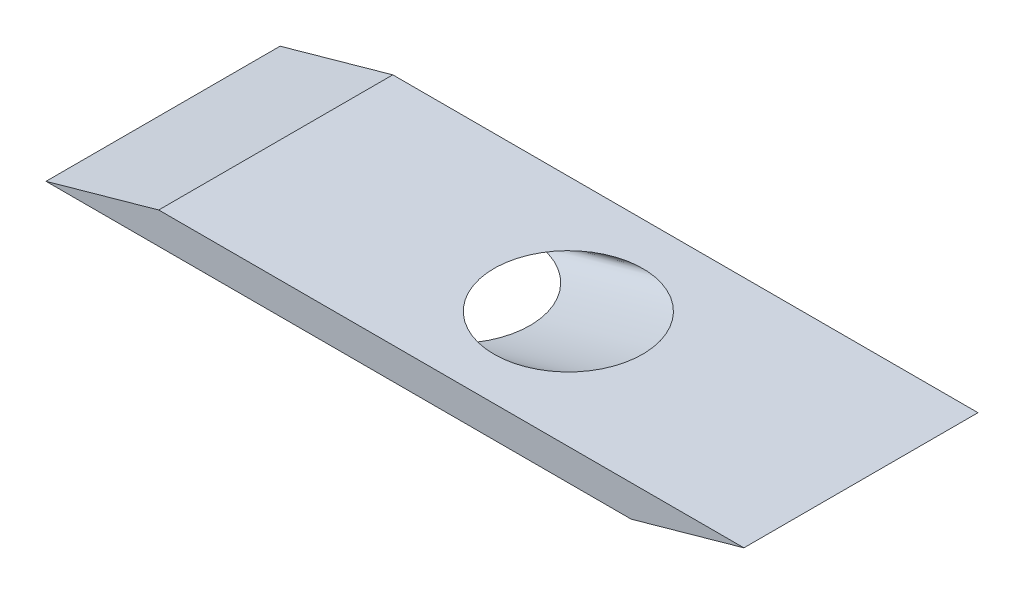
ISO-10303-21;
HEADER;
FILE_DESCRIPTION(('STEP AP214'),'2;1');
FILE_NAME('part.step','',(''),(''),'','','');
FILE_SCHEMA(('AUTOMOTIVE_DESIGN { 1 0 10303 214 1 1 1 1 }'));
ENDSEC;
DATA;
#1=APPLICATION_CONTEXT('core data for automotive mechanical design processes');
#2=APPLICATION_PROTOCOL_DEFINITION('international standard','automotive_design',2000,#1);
#3=PRODUCT_CONTEXT('',#1,'mechanical');
#4=PRODUCT('Part','Part','',(#3));
#5=PRODUCT_RELATED_PRODUCT_CATEGORY('part','',(#4));
#6=PRODUCT_DEFINITION_FORMATION('','',#4);
#7=PRODUCT_DEFINITION_CONTEXT('part definition',#1,'design');
#8=PRODUCT_DEFINITION('design','',#6,#7);
#9=PRODUCT_DEFINITION_SHAPE('','',#8);
#10=(LENGTH_UNIT() NAMED_UNIT(*) SI_UNIT(.MILLI.,.METRE.));
#11=(NAMED_UNIT(*) PLANE_ANGLE_UNIT() SI_UNIT($,.RADIAN.));
#12=(NAMED_UNIT(*) SI_UNIT($,.STERADIAN.) SOLID_ANGLE_UNIT());
#13=UNCERTAINTY_MEASURE_WITH_UNIT(LENGTH_MEASURE(1.E-05),#10,'distance_accuracy_value','');
#14=(GEOMETRIC_REPRESENTATION_CONTEXT(3) GLOBAL_UNCERTAINTY_ASSIGNED_CONTEXT((#13)) GLOBAL_UNIT_ASSIGNED_CONTEXT((#10,
#11,#12)) REPRESENTATION_CONTEXT('',''));
#15=CARTESIAN_POINT('',(0.,0.,0.));
#16=DIRECTION('',(0.,0.,1.));
#17=DIRECTION('',(1.,0.,0.));
#18=AXIS2_PLACEMENT_3D('',#15,#16,#17);
#19=CARTESIAN_POINT('',(19.2605153012445,5.38818618187283,0.));
#20=DIRECTION('',(0.,1.,0.));
#21=DIRECTION('',(0.,0.,1.));
#22=AXIS2_PLACEMENT_3D('',#19,#20,#21);
#23=PLANE('',#22);
#24=DIRECTION('',(0.,0.,-1.));
#25=VECTOR('',#24,1.);
#26=CARTESIAN_POINT('',(69.2605153012445,5.38818618187283,-20.));
#27=LINE('',#26,#25);
#28=CARTESIAN_POINT('',(69.2605153012445,5.38818618187283,20.));
#29=VERTEX_POINT('',#28);
#30=CARTESIAN_POINT('',(69.2605153012445,5.38818618187283,-20.));
#31=VERTEX_POINT('',#30);
#32=EDGE_CURVE('E85',#29,#31,#27,.T.);
#33=ORIENTED_EDGE('',*,*,#32,.T.);
#34=DIRECTION('',(-1.,0.,0.));
#35=VECTOR('',#34,1.);
#36=CARTESIAN_POINT('',(-30.7394846987555,5.38818618187283,-20.));
#37=LINE('',#36,#35);
#38=CARTESIAN_POINT('',(-30.7394846987555,5.38818618187283,-20.));
#39=VERTEX_POINT('',#38);
#40=EDGE_CURVE('E80',#31,#39,#37,.T.);
#41=ORIENTED_EDGE('',*,*,#40,.T.);
#42=DIRECTION('',(0.,0.,1.));
#43=VECTOR('',#42,1.);
#44=CARTESIAN_POINT('',(-30.7394846987555,5.38818618187283,-20.));
#45=LINE('',#44,#43);
#46=CARTESIAN_POINT('',(-30.7394846987555,5.38818618187283,20.));
#47=VERTEX_POINT('',#46);
#48=EDGE_CURVE('E83',#39,#47,#45,.T.);
#49=ORIENTED_EDGE('',*,*,#48,.T.);
#50=DIRECTION('',(1.,0.,0.));
#51=VECTOR('',#50,1.);
#52=CARTESIAN_POINT('',(-30.7394846987555,5.38818618187283,20.));
#53=LINE('',#52,#51);
#54=EDGE_CURVE('E50',#47,#29,#53,.T.);
#55=ORIENTED_EDGE('',*,*,#54,.T.);
#56=EDGE_LOOP('',(#33,#41,#49,#55));
#57=FACE_BOUND('',#56,.T.);
#58=CARTESIAN_POINT('',(19.2605153012446,5.38818618187283,0.));
#59=DIRECTION('',(0.,1.,0.));
#60=DIRECTION('',(0.,0.,1.));
#61=AXIS2_PLACEMENT_3D('',#58,#59,#60);
#62=CIRCLE('',#61,12.7);
#63=CARTESIAN_POINT('',(19.2605153012446,5.38818618187283,12.7));
#64=VERTEX_POINT('',#63);
#65=EDGE_CURVE('E100',#64,#64,#62,.T.);
#66=ORIENTED_EDGE('',*,*,#65,.F.);
#67=EDGE_LOOP('',(#66));
#68=FACE_BOUND('',#67,.T.);
#69=ADVANCED_FACE('F33',(#57,#68),#23,.T.);
#70=CARTESIAN_POINT('',(0.,0.,0.));
#71=DIRECTION('',(0.,1.,0.));
#72=DIRECTION('',(0.,0.,1.));
#73=AXIS2_PLACEMENT_3D('',#70,#71,#72);
#74=PLANE('',#73);
#75=DIRECTION('',(0.,0.,-1.));
#76=VECTOR('',#75,1.);
#77=CARTESIAN_POINT('',(50.,0.,-20.));
#78=LINE('',#77,#76);
#79=CARTESIAN_POINT('',(50.,0.,20.));
#80=VERTEX_POINT('',#79);
#81=CARTESIAN_POINT('',(50.,0.,-20.));
#82=VERTEX_POINT('',#81);
#83=EDGE_CURVE('E97',#80,#82,#78,.T.);
#84=ORIENTED_EDGE('',*,*,#83,.F.);
#85=DIRECTION('',(1.,0.,0.));
#86=VECTOR('',#85,1.);
#87=CARTESIAN_POINT('',(-50.,0.,20.));
#88=LINE('',#87,#86);
#89=CARTESIAN_POINT('',(-50.,0.,20.));
#90=VERTEX_POINT('',#89);
#91=EDGE_CURVE('E73',#90,#80,#88,.T.);
#92=ORIENTED_EDGE('',*,*,#91,.F.);
#93=DIRECTION('',(0.,0.,1.));
#94=VECTOR('',#93,1.);
#95=CARTESIAN_POINT('',(-50.,0.,-20.));
#96=LINE('',#95,#94);
#97=CARTESIAN_POINT('',(-50.,0.,-20.));
#98=VERTEX_POINT('',#97);
#99=EDGE_CURVE('E67',#98,#90,#96,.T.);
#100=ORIENTED_EDGE('',*,*,#99,.F.);
#101=DIRECTION('',(-1.,0.,0.));
#102=VECTOR('',#101,1.);
#103=CARTESIAN_POINT('',(-50.,0.,-20.));
#104=LINE('',#103,#102);
#105=EDGE_CURVE('E89',#82,#98,#104,.T.);
#106=ORIENTED_EDGE('',*,*,#105,.F.);
#107=EDGE_LOOP('',(#84,#92,#100,#106));
#108=FACE_BOUND('',#107,.T.);
#109=CARTESIAN_POINT('',(0.,0.,0.));
#110=DIRECTION('',(0.,1.,0.));
#111=DIRECTION('',(0.,0.,1.));
#112=AXIS2_PLACEMENT_3D('',#109,#110,#111);
#113=CIRCLE('',#112,12.7);
#114=CARTESIAN_POINT('',(0.,0.,12.7));
#115=VERTEX_POINT('',#114);
#116=EDGE_CURVE('E112',#115,#115,#113,.T.);
#117=ORIENTED_EDGE('',*,*,#116,.T.);
#118=EDGE_LOOP('',(#117));
#119=FACE_BOUND('',#118,.T.);
#120=ADVANCED_FACE('F108',(#108,#119),#74,.F.);
#121=CARTESIAN_POINT('',(69.2605153012445,5.38818618187283,-20.));
#122=DIRECTION('',(-0.269409309093642,0.963025765062227,0.));
#123=DIRECTION('',(-0.963025765062227,-0.269409309093642,0.));
#124=AXIS2_PLACEMENT_3D('',#121,#122,#123);
#125=PLANE('',#124);
#126=ORIENTED_EDGE('',*,*,#83,.T.);
#127=DIRECTION('',(-0.963025765062227,-0.269409309093642,0.));
#128=VECTOR('',#127,1.);
#129=CARTESIAN_POINT('',(69.2605153012445,5.38818618187283,-20.));
#130=LINE('',#129,#128);
#131=EDGE_CURVE('E11',#31,#82,#130,.T.);
#132=ORIENTED_EDGE('',*,*,#131,.F.);
#133=ORIENTED_EDGE('',*,*,#32,.F.);
#134=DIRECTION('',(-0.963025765062227,-0.269409309093642,0.));
#135=VECTOR('',#134,1.);
#136=CARTESIAN_POINT('',(69.2605153012445,5.38818618187283,20.));
#137=LINE('',#136,#135);
#138=EDGE_CURVE('E93',#29,#80,#137,.T.);
#139=ORIENTED_EDGE('',*,*,#138,.T.);
#140=EDGE_LOOP('',(#126,#132,#133,#139));
#141=FACE_BOUND('',#140,.T.);
#142=ADVANCED_FACE('F35',(#141),#125,.F.);
#143=CARTESIAN_POINT('',(-30.7394846987555,5.38818618187283,-20.));
#144=DIRECTION('',(0.,0.,1.));
#145=DIRECTION('',(1.,0.,0.));
#146=AXIS2_PLACEMENT_3D('',#143,#144,#145);
#147=PLANE('',#146);
#148=ORIENTED_EDGE('',*,*,#105,.T.);
#149=DIRECTION('',(-0.963025765062227,-0.269409309093642,0.));
#150=VECTOR('',#149,1.);
#151=CARTESIAN_POINT('',(-30.7394846987555,5.38818618187283,-20.));
#152=LINE('',#151,#150);
#153=EDGE_CURVE('E42',#39,#98,#152,.T.);
#154=ORIENTED_EDGE('',*,*,#153,.F.);
#155=ORIENTED_EDGE('',*,*,#40,.F.);
#156=ORIENTED_EDGE('',*,*,#131,.T.);
#157=EDGE_LOOP('',(#148,#154,#155,#156));
#158=FACE_BOUND('',#157,.T.);
#159=ADVANCED_FACE('F88',(#158),#147,.F.);
#160=CARTESIAN_POINT('',(-30.7394846987555,5.38818618187283,-20.));
#161=DIRECTION('',(0.269409309093642,-0.963025765062227,0.));
#162=DIRECTION('',(0.963025765062227,0.269409309093642,0.));
#163=AXIS2_PLACEMENT_3D('',#160,#161,#162);
#164=PLANE('',#163);
#165=ORIENTED_EDGE('',*,*,#99,.T.);
#166=DIRECTION('',(-0.963025765062227,-0.269409309093642,0.));
#167=VECTOR('',#166,1.);
#168=CARTESIAN_POINT('',(-30.7394846987555,5.38818618187283,20.));
#169=LINE('',#168,#167);
#170=EDGE_CURVE('E90',#47,#90,#169,.T.);
#171=ORIENTED_EDGE('',*,*,#170,.F.);
#172=ORIENTED_EDGE('',*,*,#48,.F.);
#173=ORIENTED_EDGE('',*,*,#153,.T.);
#174=EDGE_LOOP('',(#165,#171,#172,#173));
#175=FACE_BOUND('',#174,.T.);
#176=ADVANCED_FACE('F91',(#175),#164,.F.);
#177=CARTESIAN_POINT('',(-30.7394846987555,5.38818618187283,20.));
#178=DIRECTION('',(0.,0.,-1.));
#179=DIRECTION('',(-1.,0.,0.));
#180=AXIS2_PLACEMENT_3D('',#177,#178,#179);
#181=PLANE('',#180);
#182=ORIENTED_EDGE('',*,*,#91,.T.);
#183=ORIENTED_EDGE('',*,*,#138,.F.);
#184=ORIENTED_EDGE('',*,*,#54,.F.);
#185=ORIENTED_EDGE('',*,*,#170,.T.);
#186=EDGE_LOOP('',(#182,#183,#184,#185));
#187=FACE_BOUND('',#186,.T.);
#188=ADVANCED_FACE('F105',(#187),#181,.F.);
#189=DIRECTION('',(-0.963025765062227,-0.269409309093642,0.));
#190=VECTOR('',#189,1.);
#191=SURFACE_OF_LINEAR_EXTRUSION('',#62,#190);
#192=ORIENTED_EDGE('',*,*,#65,.T.);
#193=EDGE_LOOP('',(#192));
#194=FACE_BOUND('',#193,.T.);
#195=ORIENTED_EDGE('',*,*,#116,.F.);
#196=EDGE_LOOP('',(#195));
#197=FACE_BOUND('',#196,.T.);
#198=ADVANCED_FACE('F118',(#194,#197),#191,.T.);
#199=CLOSED_SHELL('',(#69,#120,#142,#159,#176,#188,#198));
#200=MANIFOLD_SOLID_BREP('B2',#199);
#201=ADVANCED_BREP_SHAPE_REPRESENTATION('',(#18,#200),#14);
#202=SHAPE_DEFINITION_REPRESENTATION(#9,#201);
ENDSEC;
END-ISO-10303-21;
